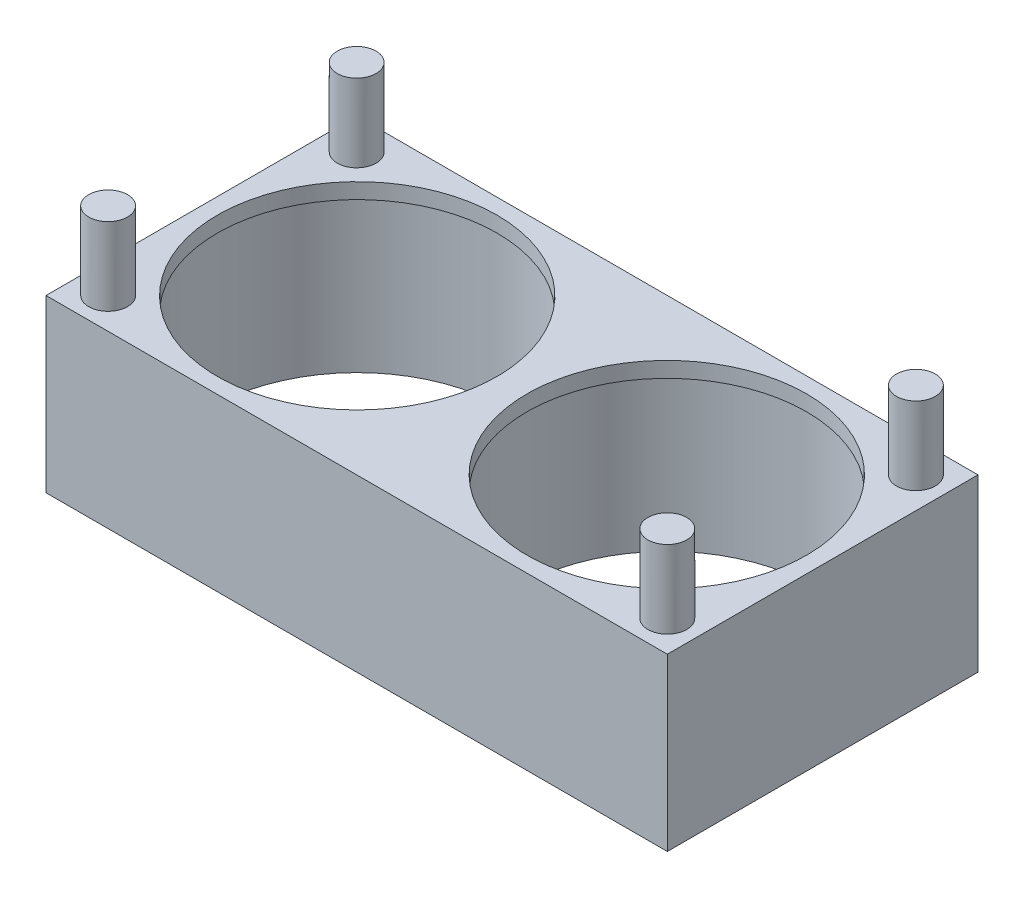
ISO-10303-21;
HEADER;
FILE_DESCRIPTION(('STEP AP214'),'2;1');
FILE_NAME('part.step','',(''),(''),'','','');
FILE_SCHEMA(('AUTOMOTIVE_DESIGN { 1 0 10303 214 1 1 1 1 }'));
ENDSEC;
DATA;
#1=APPLICATION_CONTEXT('core data for automotive mechanical design processes');
#2=APPLICATION_PROTOCOL_DEFINITION('international standard','automotive_design',2000,#1);
#3=PRODUCT_CONTEXT('',#1,'mechanical');
#4=PRODUCT('Part','Part','',(#3));
#5=PRODUCT_RELATED_PRODUCT_CATEGORY('part','',(#4));
#6=PRODUCT_DEFINITION_FORMATION('','',#4);
#7=PRODUCT_DEFINITION_CONTEXT('part definition',#1,'design');
#8=PRODUCT_DEFINITION('design','',#6,#7);
#9=PRODUCT_DEFINITION_SHAPE('','',#8);
#10=(LENGTH_UNIT() NAMED_UNIT(*) SI_UNIT(.MILLI.,.METRE.));
#11=(NAMED_UNIT(*) PLANE_ANGLE_UNIT() SI_UNIT($,.RADIAN.));
#12=(NAMED_UNIT(*) SI_UNIT($,.STERADIAN.) SOLID_ANGLE_UNIT());
#13=UNCERTAINTY_MEASURE_WITH_UNIT(LENGTH_MEASURE(1.E-05),#10,'distance_accuracy_value','');
#14=(GEOMETRIC_REPRESENTATION_CONTEXT(3) GLOBAL_UNCERTAINTY_ASSIGNED_CONTEXT((#13)) GLOBAL_UNIT_ASSIGNED_CONTEXT((#10,
#11,#12)) REPRESENTATION_CONTEXT('',''));
#15=CARTESIAN_POINT('',(0.,0.,0.));
#16=DIRECTION('',(0.,0.,1.));
#17=DIRECTION('',(1.,0.,0.));
#18=AXIS2_PLACEMENT_3D('',#15,#16,#17);
#19=CARTESIAN_POINT('',(0.,22.,0.));
#20=DIRECTION('',(0.,-1.,0.));
#21=DIRECTION('',(0.,0.,-1.));
#22=AXIS2_PLACEMENT_3D('',#19,#20,#21);
#23=PLANE('',#22);
#24=CARTESIAN_POINT('',(76.,22.,-4.00000000000001));
#25=DIRECTION('',(0.,-1.,0.));
#26=DIRECTION('',(0.,0.,-1.));
#27=AXIS2_PLACEMENT_3D('',#24,#25,#26);
#28=CIRCLE('',#27,2.50000000000001);
#29=CARTESIAN_POINT('',(76.,22.,-6.50000000000001));
#30=VERTEX_POINT('',#29);
#31=EDGE_CURVE('E41',#30,#30,#28,.F.);
#32=ORIENTED_EDGE('',*,*,#31,.F.);
#33=EDGE_LOOP('',(#32));
#34=FACE_BOUND('',#33,.T.);
#35=CARTESIAN_POINT('',(4.,22.,-36.));
#36=DIRECTION('',(0.,-1.,0.));
#37=DIRECTION('',(0.,0.,-1.));
#38=AXIS2_PLACEMENT_3D('',#35,#36,#37);
#39=CIRCLE('',#38,2.5);
#40=CARTESIAN_POINT('',(4.,22.,-38.5));
#41=VERTEX_POINT('',#40);
#42=EDGE_CURVE('E110',#41,#41,#39,.F.);
#43=ORIENTED_EDGE('',*,*,#42,.F.);
#44=EDGE_LOOP('',(#43));
#45=FACE_BOUND('',#44,.T.);
#46=CARTESIAN_POINT('',(59.93,22.,-20.));
#47=DIRECTION('',(0.,-1.,0.));
#48=DIRECTION('',(0.,0.,-1.));
#49=AXIS2_PLACEMENT_3D('',#46,#47,#48);
#50=CIRCLE('',#49,17.999999941);
#51=CARTESIAN_POINT('',(59.93,22.,-37.999999941));
#52=VERTEX_POINT('',#51);
#53=EDGE_CURVE('E128',#52,#52,#50,.T.);
#54=ORIENTED_EDGE('',*,*,#53,.T.);
#55=EDGE_LOOP('',(#54));
#56=FACE_BOUND('',#55,.T.);
#57=CARTESIAN_POINT('',(20.07,22.,-20.));
#58=DIRECTION('',(0.,-1.,0.));
#59=DIRECTION('',(0.,0.,-1.));
#60=AXIS2_PLACEMENT_3D('',#57,#58,#59);
#61=CIRCLE('',#60,17.999999941);
#62=CARTESIAN_POINT('',(20.07,22.,-37.999999941));
#63=VERTEX_POINT('',#62);
#64=EDGE_CURVE('E131',#63,#63,#61,.T.);
#65=ORIENTED_EDGE('',*,*,#64,.T.);
#66=EDGE_LOOP('',(#65));
#67=FACE_BOUND('',#66,.T.);
#68=DIRECTION('',(0.,0.,1.));
#69=VECTOR('',#68,1.);
#70=CARTESIAN_POINT('',(0.,22.,0.));
#71=LINE('',#70,#69);
#72=CARTESIAN_POINT('',(0.,22.,-40.));
#73=VERTEX_POINT('',#72);
#74=CARTESIAN_POINT('',(0.,22.,0.));
#75=VERTEX_POINT('',#74);
#76=EDGE_CURVE('E85',#73,#75,#71,.T.);
#77=ORIENTED_EDGE('',*,*,#76,.T.);
#78=DIRECTION('',(1.,0.,0.));
#79=VECTOR('',#78,1.);
#80=CARTESIAN_POINT('',(0.,22.,0.));
#81=LINE('',#80,#79);
#82=CARTESIAN_POINT('',(80.,22.,0.));
#83=VERTEX_POINT('',#82);
#84=EDGE_CURVE('E80',#75,#83,#81,.T.);
#85=ORIENTED_EDGE('',*,*,#84,.T.);
#86=DIRECTION('',(0.,0.,-1.));
#87=VECTOR('',#86,1.);
#88=CARTESIAN_POINT('',(80.,22.,0.));
#89=LINE('',#88,#87);
#90=CARTESIAN_POINT('',(80.,22.,-40.));
#91=VERTEX_POINT('',#90);
#92=EDGE_CURVE('E83',#83,#91,#89,.T.);
#93=ORIENTED_EDGE('',*,*,#92,.T.);
#94=DIRECTION('',(-1.,0.,0.));
#95=VECTOR('',#94,1.);
#96=CARTESIAN_POINT('',(0.,22.,-40.));
#97=LINE('',#96,#95);
#98=EDGE_CURVE('E49',#91,#73,#97,.T.);
#99=ORIENTED_EDGE('',*,*,#98,.T.);
#100=EDGE_LOOP('',(#77,#85,#93,#99));
#101=FACE_BOUND('',#100,.T.);
#102=CARTESIAN_POINT('',(76.,22.,-36.));
#103=DIRECTION('',(0.,-1.,0.));
#104=DIRECTION('',(0.,0.,-1.));
#105=AXIS2_PLACEMENT_3D('',#102,#103,#104);
#106=CIRCLE('',#105,2.5);
#107=CARTESIAN_POINT('',(76.,22.,-38.5));
#108=VERTEX_POINT('',#107);
#109=EDGE_CURVE('E113',#108,#108,#106,.F.);
#110=ORIENTED_EDGE('',*,*,#109,.F.);
#111=EDGE_LOOP('',(#110));
#112=FACE_BOUND('',#111,.T.);
#113=CARTESIAN_POINT('',(4.,22.,-4.));
#114=DIRECTION('',(0.,-1.,0.));
#115=DIRECTION('',(0.,0.,-1.));
#116=AXIS2_PLACEMENT_3D('',#113,#114,#115);
#117=CIRCLE('',#116,2.5);
#118=CARTESIAN_POINT('',(4.,22.,-6.5));
#119=VERTEX_POINT('',#118);
#120=EDGE_CURVE('E11',#119,#119,#117,.F.);
#121=ORIENTED_EDGE('',*,*,#120,.F.);
#122=EDGE_LOOP('',(#121));
#123=FACE_BOUND('',#122,.T.);
#124=ADVANCED_FACE('F32',(#34,#45,#56,#67,#101,#112,#123),#23,.F.);
#125=CARTESIAN_POINT('',(0.,22.,0.));
#126=DIRECTION('',(1.,0.,0.));
#127=DIRECTION('',(0.,0.,-1.));
#128=AXIS2_PLACEMENT_3D('',#125,#126,#127);
#129=PLANE('',#128);
#130=DIRECTION('',(0.,0.,1.));
#131=VECTOR('',#130,1.);
#132=CARTESIAN_POINT('',(0.,0.,0.));
#133=LINE('',#132,#131);
#134=CARTESIAN_POINT('',(0.,0.,-40.));
#135=VERTEX_POINT('',#134);
#136=CARTESIAN_POINT('',(0.,0.,0.));
#137=VERTEX_POINT('',#136);
#138=EDGE_CURVE('E100',#135,#137,#133,.T.);
#139=ORIENTED_EDGE('',*,*,#138,.T.);
#140=DIRECTION('',(0.,-1.,0.));
#141=VECTOR('',#140,1.);
#142=CARTESIAN_POINT('',(0.,22.,0.));
#143=LINE('',#142,#141);
#144=EDGE_CURVE('E91',#75,#137,#143,.T.);
#145=ORIENTED_EDGE('',*,*,#144,.F.);
#146=ORIENTED_EDGE('',*,*,#76,.F.);
#147=DIRECTION('',(0.,-1.,0.));
#148=VECTOR('',#147,1.);
#149=CARTESIAN_POINT('',(0.,22.,-40.));
#150=LINE('',#149,#148);
#151=EDGE_CURVE('E96',#73,#135,#150,.T.);
#152=ORIENTED_EDGE('',*,*,#151,.T.);
#153=EDGE_LOOP('',(#139,#145,#146,#152));
#154=FACE_BOUND('',#153,.T.);
#155=ADVANCED_FACE('F34',(#154),#129,.F.);
#156=CARTESIAN_POINT('',(0.,22.,0.));
#157=DIRECTION('',(0.,0.,-1.));
#158=DIRECTION('',(-1.,0.,0.));
#159=AXIS2_PLACEMENT_3D('',#156,#157,#158);
#160=PLANE('',#159);
#161=DIRECTION('',(1.,0.,0.));
#162=VECTOR('',#161,1.);
#163=CARTESIAN_POINT('',(0.,0.,0.));
#164=LINE('',#163,#162);
#165=CARTESIAN_POINT('',(80.,0.,0.));
#166=VERTEX_POINT('',#165);
#167=EDGE_CURVE('E90',#137,#166,#164,.T.);
#168=ORIENTED_EDGE('',*,*,#167,.T.);
#169=DIRECTION('',(0.,-1.,0.));
#170=VECTOR('',#169,1.);
#171=CARTESIAN_POINT('',(80.,22.,0.));
#172=LINE('',#171,#170);
#173=EDGE_CURVE('E88',#83,#166,#172,.T.);
#174=ORIENTED_EDGE('',*,*,#173,.F.);
#175=ORIENTED_EDGE('',*,*,#84,.F.);
#176=ORIENTED_EDGE('',*,*,#144,.T.);
#177=EDGE_LOOP('',(#168,#174,#175,#176));
#178=FACE_BOUND('',#177,.T.);
#179=ADVANCED_FACE('F89',(#178),#160,.F.);
#180=CARTESIAN_POINT('',(80.,22.,0.));
#181=DIRECTION('',(-1.,0.,0.));
#182=DIRECTION('',(0.,0.,1.));
#183=AXIS2_PLACEMENT_3D('',#180,#181,#182);
#184=PLANE('',#183);
#185=DIRECTION('',(0.,0.,-1.));
#186=VECTOR('',#185,1.);
#187=CARTESIAN_POINT('',(80.,0.,0.));
#188=LINE('',#187,#186);
#189=CARTESIAN_POINT('',(80.,0.,-40.));
#190=VERTEX_POINT('',#189);
#191=EDGE_CURVE('E66',#166,#190,#188,.T.);
#192=ORIENTED_EDGE('',*,*,#191,.T.);
#193=DIRECTION('',(0.,-1.,0.));
#194=VECTOR('',#193,1.);
#195=CARTESIAN_POINT('',(80.,22.,-40.));
#196=LINE('',#195,#194);
#197=EDGE_CURVE('E92',#91,#190,#196,.T.);
#198=ORIENTED_EDGE('',*,*,#197,.F.);
#199=ORIENTED_EDGE('',*,*,#92,.F.);
#200=ORIENTED_EDGE('',*,*,#173,.T.);
#201=EDGE_LOOP('',(#192,#198,#199,#200));
#202=FACE_BOUND('',#201,.T.);
#203=ADVANCED_FACE('F94',(#202),#184,.F.);
#204=CARTESIAN_POINT('',(0.,22.,-40.));
#205=DIRECTION('',(0.,0.,1.));
#206=DIRECTION('',(1.,0.,0.));
#207=AXIS2_PLACEMENT_3D('',#204,#205,#206);
#208=PLANE('',#207);
#209=DIRECTION('',(-1.,0.,0.));
#210=VECTOR('',#209,1.);
#211=CARTESIAN_POINT('',(0.,0.,-40.));
#212=LINE('',#211,#210);
#213=EDGE_CURVE('E72',#190,#135,#212,.T.);
#214=ORIENTED_EDGE('',*,*,#213,.T.);
#215=ORIENTED_EDGE('',*,*,#151,.F.);
#216=ORIENTED_EDGE('',*,*,#98,.F.);
#217=ORIENTED_EDGE('',*,*,#197,.T.);
#218=EDGE_LOOP('',(#214,#215,#216,#217));
#219=FACE_BOUND('',#218,.T.);
#220=ADVANCED_FACE('F158',(#219),#208,.F.);
#221=CARTESIAN_POINT('',(0.,0.,0.));
#222=DIRECTION('',(0.,-1.,0.));
#223=DIRECTION('',(0.,0.,-1.));
#224=AXIS2_PLACEMENT_3D('',#221,#222,#223);
#225=PLANE('',#224);
#226=CARTESIAN_POINT('',(59.93,0.,-20.));
#227=DIRECTION('',(0.,-1.,0.));
#228=DIRECTION('',(0.,0.,-1.));
#229=AXIS2_PLACEMENT_3D('',#226,#227,#228);
#230=CIRCLE('',#229,19.);
#231=CARTESIAN_POINT('',(59.93,0.,-39.));
#232=VERTEX_POINT('',#231);
#233=EDGE_CURVE('E133',#232,#232,#230,.T.);
#234=ORIENTED_EDGE('',*,*,#233,.F.);
#235=EDGE_LOOP('',(#234));
#236=FACE_BOUND('',#235,.T.);
#237=CARTESIAN_POINT('',(20.07,0.,-20.));
#238=DIRECTION('',(0.,-1.,0.));
#239=DIRECTION('',(0.,0.,-1.));
#240=AXIS2_PLACEMENT_3D('',#237,#238,#239);
#241=CIRCLE('',#240,19.);
#242=CARTESIAN_POINT('',(20.07,0.,-39.));
#243=VERTEX_POINT('',#242);
#244=EDGE_CURVE('E146',#243,#243,#241,.T.);
#245=ORIENTED_EDGE('',*,*,#244,.F.);
#246=EDGE_LOOP('',(#245));
#247=FACE_BOUND('',#246,.T.);
#248=ORIENTED_EDGE('',*,*,#138,.F.);
#249=ORIENTED_EDGE('',*,*,#213,.F.);
#250=ORIENTED_EDGE('',*,*,#191,.F.);
#251=ORIENTED_EDGE('',*,*,#167,.F.);
#252=EDGE_LOOP('',(#248,#249,#250,#251));
#253=FACE_BOUND('',#252,.T.);
#254=ADVANCED_FACE('F155',(#236,#247,#253),#225,.T.);
#255=CARTESIAN_POINT('',(20.07,20.,-20.));
#256=DIRECTION('',(0.,-1.,0.));
#257=DIRECTION('',(0.,0.,-1.));
#258=AXIS2_PLACEMENT_3D('',#255,#256,#257);
#259=CYLINDRICAL_SURFACE('',#258,19.);
#260=CARTESIAN_POINT('',(20.07,20.,-20.));
#261=DIRECTION('',(0.,-1.,0.));
#262=DIRECTION('',(0.,0.,-1.));
#263=AXIS2_PLACEMENT_3D('',#260,#261,#262);
#264=CIRCLE('',#263,19.);
#265=CARTESIAN_POINT('',(20.07,20.,-39.));
#266=VERTEX_POINT('',#265);
#267=EDGE_CURVE('E103',#266,#266,#264,.T.);
#268=ORIENTED_EDGE('',*,*,#267,.F.);
#269=EDGE_LOOP('',(#268));
#270=FACE_BOUND('',#269,.T.);
#271=ORIENTED_EDGE('',*,*,#244,.T.);
#272=EDGE_LOOP('',(#271));
#273=FACE_BOUND('',#272,.T.);
#274=ADVANCED_FACE('F153',(#270,#273),#259,.F.);
#275=CARTESIAN_POINT('',(20.07,20.,-20.));
#276=DIRECTION('',(0.,-1.,0.));
#277=DIRECTION('',(0.,0.,-1.));
#278=AXIS2_PLACEMENT_3D('',#275,#276,#277);
#279=PLANE('',#278);
#280=CARTESIAN_POINT('',(20.07,20.,-20.));
#281=DIRECTION('',(0.,-1.,0.));
#282=DIRECTION('',(0.,0.,-1.));
#283=AXIS2_PLACEMENT_3D('',#280,#281,#282);
#284=CIRCLE('',#283,17.999999941);
#285=CARTESIAN_POINT('',(20.07,20.,-37.999999941));
#286=VERTEX_POINT('',#285);
#287=EDGE_CURVE('E134',#286,#286,#284,.T.);
#288=ORIENTED_EDGE('',*,*,#287,.F.);
#289=EDGE_LOOP('',(#288));
#290=FACE_BOUND('',#289,.T.);
#291=ORIENTED_EDGE('',*,*,#267,.T.);
#292=EDGE_LOOP('',(#291));
#293=FACE_BOUND('',#292,.T.);
#294=ADVANCED_FACE('F282',(#290,#293),#279,.T.);
#295=CARTESIAN_POINT('',(59.93,20.,-20.));
#296=DIRECTION('',(0.,-1.,0.));
#297=DIRECTION('',(0.,0.,-1.));
#298=AXIS2_PLACEMENT_3D('',#295,#296,#297);
#299=CYLINDRICAL_SURFACE('',#298,19.);
#300=CARTESIAN_POINT('',(59.93,20.,-20.));
#301=DIRECTION('',(0.,-1.,0.));
#302=DIRECTION('',(0.,0.,-1.));
#303=AXIS2_PLACEMENT_3D('',#300,#301,#302);
#304=CIRCLE('',#303,19.);
#305=CARTESIAN_POINT('',(59.93,20.,-39.));
#306=VERTEX_POINT('',#305);
#307=EDGE_CURVE('E137',#306,#306,#304,.T.);
#308=ORIENTED_EDGE('',*,*,#307,.F.);
#309=EDGE_LOOP('',(#308));
#310=FACE_BOUND('',#309,.T.);
#311=ORIENTED_EDGE('',*,*,#233,.T.);
#312=EDGE_LOOP('',(#311));
#313=FACE_BOUND('',#312,.T.);
#314=ADVANCED_FACE('F278',(#310,#313),#299,.F.);
#315=CARTESIAN_POINT('',(59.93,20.,-20.));
#316=DIRECTION('',(0.,-1.,0.));
#317=DIRECTION('',(0.,0.,-1.));
#318=AXIS2_PLACEMENT_3D('',#315,#316,#317);
#319=PLANE('',#318);
#320=CARTESIAN_POINT('',(59.93,20.,-20.));
#321=DIRECTION('',(0.,-1.,0.));
#322=DIRECTION('',(0.,0.,-1.));
#323=AXIS2_PLACEMENT_3D('',#320,#321,#322);
#324=CIRCLE('',#323,17.999999941);
#325=CARTESIAN_POINT('',(59.93,20.,-37.999999941));
#326=VERTEX_POINT('',#325);
#327=EDGE_CURVE('E142',#326,#326,#324,.T.);
#328=ORIENTED_EDGE('',*,*,#327,.F.);
#329=EDGE_LOOP('',(#328));
#330=FACE_BOUND('',#329,.T.);
#331=ORIENTED_EDGE('',*,*,#307,.T.);
#332=EDGE_LOOP('',(#331));
#333=FACE_BOUND('',#332,.T.);
#334=ADVANCED_FACE('F275',(#330,#333),#319,.T.);
#335=CARTESIAN_POINT('',(20.07,22.,-20.));
#336=DIRECTION('',(0.,-1.,0.));
#337=DIRECTION('',(0.,0.,-1.));
#338=AXIS2_PLACEMENT_3D('',#335,#336,#337);
#339=CYLINDRICAL_SURFACE('',#338,17.999999941);
#340=ORIENTED_EDGE('',*,*,#64,.F.);
#341=EDGE_LOOP('',(#340));
#342=FACE_BOUND('',#341,.T.);
#343=ORIENTED_EDGE('',*,*,#287,.T.);
#344=EDGE_LOOP('',(#343));
#345=FACE_BOUND('',#344,.T.);
#346=ADVANCED_FACE('F271',(#342,#345),#339,.F.);
#347=CARTESIAN_POINT('',(59.93,22.,-20.));
#348=DIRECTION('',(0.,-1.,0.));
#349=DIRECTION('',(0.,0.,-1.));
#350=AXIS2_PLACEMENT_3D('',#347,#348,#349);
#351=CYLINDRICAL_SURFACE('',#350,17.999999941);
#352=ORIENTED_EDGE('',*,*,#53,.F.);
#353=EDGE_LOOP('',(#352));
#354=FACE_BOUND('',#353,.T.);
#355=ORIENTED_EDGE('',*,*,#327,.T.);
#356=EDGE_LOOP('',(#355));
#357=FACE_BOUND('',#356,.T.);
#358=ADVANCED_FACE('F187',(#354,#357),#351,.F.);
#359=CARTESIAN_POINT('',(4.,32.,-36.));
#360=DIRECTION('',(0.,-1.,0.));
#361=DIRECTION('',(0.,0.,-1.));
#362=AXIS2_PLACEMENT_3D('',#359,#360,#361);
#363=CYLINDRICAL_SURFACE('',#362,2.5);
#364=CARTESIAN_POINT('',(4.,32.,-36.));
#365=DIRECTION('',(0.,1.,0.));
#366=DIRECTION('',(0.,0.,1.));
#367=AXIS2_PLACEMENT_3D('',#364,#365,#366);
#368=CIRCLE('',#367,2.5);
#369=CARTESIAN_POINT('',(4.,32.,-33.5));
#370=VERTEX_POINT('',#369);
#371=EDGE_CURVE('E354',#370,#370,#368,.T.);
#372=ORIENTED_EDGE('',*,*,#371,.F.);
#373=EDGE_LOOP('',(#372));
#374=FACE_BOUND('',#373,.T.);
#375=ORIENTED_EDGE('',*,*,#42,.T.);
#376=EDGE_LOOP('',(#375));
#377=FACE_BOUND('',#376,.T.);
#378=ADVANCED_FACE('F191',(#374,#377),#363,.T.);
#379=CARTESIAN_POINT('',(4.,32.,-36.));
#380=DIRECTION('',(0.,1.,0.));
#381=DIRECTION('',(0.,0.,1.));
#382=AXIS2_PLACEMENT_3D('',#379,#380,#381);
#383=PLANE('',#382);
#384=ORIENTED_EDGE('',*,*,#371,.T.);
#385=EDGE_LOOP('',(#384));
#386=FACE_BOUND('',#385,.T.);
#387=ADVANCED_FACE('F195',(#386),#383,.T.);
#388=CARTESIAN_POINT('',(76.,32.,-36.));
#389=DIRECTION('',(0.,-1.,0.));
#390=DIRECTION('',(0.,0.,-1.));
#391=AXIS2_PLACEMENT_3D('',#388,#389,#390);
#392=CYLINDRICAL_SURFACE('',#391,2.5);
#393=CARTESIAN_POINT('',(76.,32.,-36.));
#394=DIRECTION('',(0.,1.,0.));
#395=DIRECTION('',(0.,0.,1.));
#396=AXIS2_PLACEMENT_3D('',#393,#394,#395);
#397=CIRCLE('',#396,2.5);
#398=CARTESIAN_POINT('',(76.,32.,-33.5));
#399=VERTEX_POINT('',#398);
#400=EDGE_CURVE('E356',#399,#399,#397,.T.);
#401=ORIENTED_EDGE('',*,*,#400,.F.);
#402=EDGE_LOOP('',(#401));
#403=FACE_BOUND('',#402,.T.);
#404=ORIENTED_EDGE('',*,*,#109,.T.);
#405=EDGE_LOOP('',(#404));
#406=FACE_BOUND('',#405,.T.);
#407=ADVANCED_FACE('F205',(#403,#406),#392,.T.);
#408=CARTESIAN_POINT('',(76.,32.,-36.));
#409=DIRECTION('',(0.,1.,0.));
#410=DIRECTION('',(0.,0.,1.));
#411=AXIS2_PLACEMENT_3D('',#408,#409,#410);
#412=PLANE('',#411);
#413=ORIENTED_EDGE('',*,*,#400,.T.);
#414=EDGE_LOOP('',(#413));
#415=FACE_BOUND('',#414,.T.);
#416=ADVANCED_FACE('F215',(#415),#412,.T.);
#417=CARTESIAN_POINT('',(76.,32.,-4.00000000000001));
#418=DIRECTION('',(0.,-1.,0.));
#419=DIRECTION('',(0.,0.,-1.));
#420=AXIS2_PLACEMENT_3D('',#417,#418,#419);
#421=CYLINDRICAL_SURFACE('',#420,2.50000000000001);
#422=CARTESIAN_POINT('',(76.,32.,-4.00000000000001));
#423=DIRECTION('',(0.,1.,0.));
#424=DIRECTION('',(0.,0.,1.));
#425=AXIS2_PLACEMENT_3D('',#422,#423,#424);
#426=CIRCLE('',#425,2.50000000000001);
#427=CARTESIAN_POINT('',(76.,32.,-1.5));
#428=VERTEX_POINT('',#427);
#429=EDGE_CURVE('E360',#428,#428,#426,.T.);
#430=ORIENTED_EDGE('',*,*,#429,.F.);
#431=EDGE_LOOP('',(#430));
#432=FACE_BOUND('',#431,.T.);
#433=ORIENTED_EDGE('',*,*,#31,.T.);
#434=EDGE_LOOP('',(#433));
#435=FACE_BOUND('',#434,.T.);
#436=ADVANCED_FACE('F118',(#432,#435),#421,.T.);
#437=CARTESIAN_POINT('',(76.,32.,-4.00000000000001));
#438=DIRECTION('',(0.,1.,0.));
#439=DIRECTION('',(0.,0.,1.));
#440=AXIS2_PLACEMENT_3D('',#437,#438,#439);
#441=PLANE('',#440);
#442=ORIENTED_EDGE('',*,*,#429,.T.);
#443=EDGE_LOOP('',(#442));
#444=FACE_BOUND('',#443,.T.);
#445=ADVANCED_FACE('F234',(#444),#441,.T.);
#446=CARTESIAN_POINT('',(4.,32.,-4.));
#447=DIRECTION('',(0.,-1.,0.));
#448=DIRECTION('',(0.,0.,-1.));
#449=AXIS2_PLACEMENT_3D('',#446,#447,#448);
#450=CYLINDRICAL_SURFACE('',#449,2.5);
#451=CARTESIAN_POINT('',(4.,32.,-4.));
#452=DIRECTION('',(0.,1.,0.));
#453=DIRECTION('',(0.,0.,1.));
#454=AXIS2_PLACEMENT_3D('',#451,#452,#453);
#455=CIRCLE('',#454,2.5);
#456=CARTESIAN_POINT('',(4.,32.,-1.5));
#457=VERTEX_POINT('',#456);
#458=EDGE_CURVE('E365',#457,#457,#455,.T.);
#459=ORIENTED_EDGE('',*,*,#458,.F.);
#460=EDGE_LOOP('',(#459));
#461=FACE_BOUND('',#460,.T.);
#462=ORIENTED_EDGE('',*,*,#120,.T.);
#463=EDGE_LOOP('',(#462));
#464=FACE_BOUND('',#463,.T.);
#465=ADVANCED_FACE('F244',(#461,#464),#450,.T.);
#466=CARTESIAN_POINT('',(4.,32.,-4.));
#467=DIRECTION('',(0.,1.,0.));
#468=DIRECTION('',(0.,0.,1.));
#469=AXIS2_PLACEMENT_3D('',#466,#467,#468);
#470=PLANE('',#469);
#471=ORIENTED_EDGE('',*,*,#458,.T.);
#472=EDGE_LOOP('',(#471));
#473=FACE_BOUND('',#472,.T.);
#474=ADVANCED_FACE('F254',(#473),#470,.T.);
#475=CLOSED_SHELL('',(#124,#155,#179,#203,#220,#254,#274,#294,#314,#334,#346,#358,#378,#387,
#407,#416,#436,#445,#465,#474));
#476=MANIFOLD_SOLID_BREP('B2',#475);
#477=ADVANCED_BREP_SHAPE_REPRESENTATION('',(#18,#476),#14);
#478=SHAPE_DEFINITION_REPRESENTATION(#9,#477);
ENDSEC;
END-ISO-10303-21;
